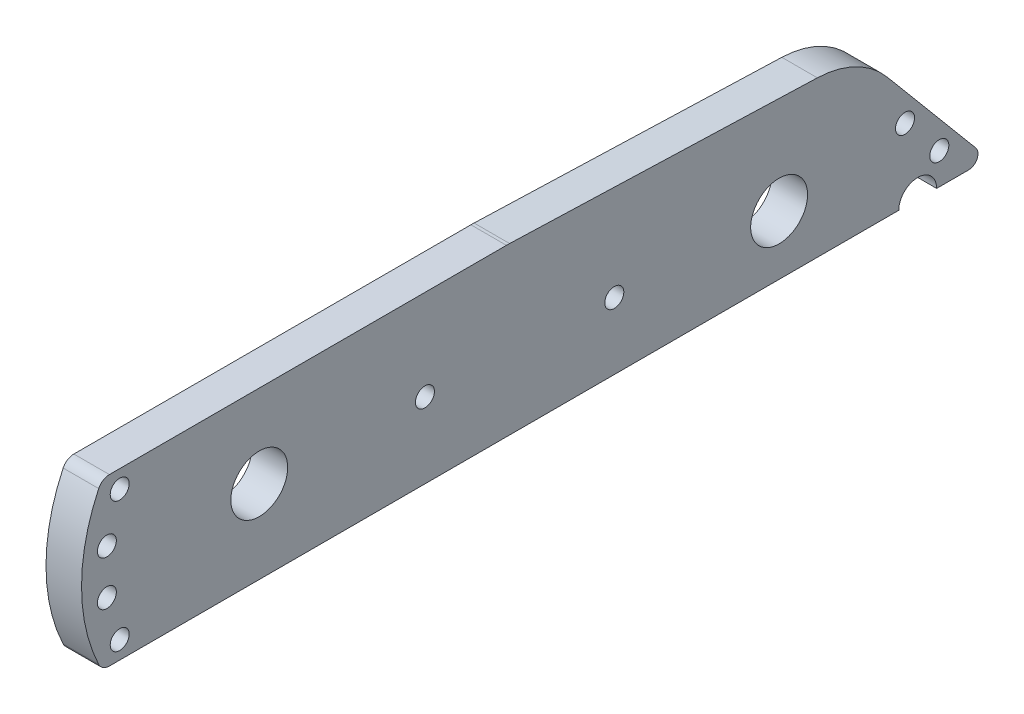
ISO-10303-21;
HEADER;
FILE_DESCRIPTION(('STEP AP214'),'2;1');
FILE_NAME('part.step','',(''),(''),'','','');
FILE_SCHEMA(('AUTOMOTIVE_DESIGN { 1 0 10303 214 1 1 1 1 }'));
ENDSEC;
DATA;
#1=APPLICATION_CONTEXT('core data for automotive mechanical design processes');
#2=APPLICATION_PROTOCOL_DEFINITION('international standard','automotive_design',2000,#1);
#3=PRODUCT_CONTEXT('',#1,'mechanical');
#4=PRODUCT('Part','Part','',(#3));
#5=PRODUCT_RELATED_PRODUCT_CATEGORY('part','',(#4));
#6=PRODUCT_DEFINITION_FORMATION('','',#4);
#7=PRODUCT_DEFINITION_CONTEXT('part definition',#1,'design');
#8=PRODUCT_DEFINITION('design','',#6,#7);
#9=PRODUCT_DEFINITION_SHAPE('','',#8);
#10=(LENGTH_UNIT() NAMED_UNIT(*) SI_UNIT(.MILLI.,.METRE.));
#11=(NAMED_UNIT(*) PLANE_ANGLE_UNIT() SI_UNIT($,.RADIAN.));
#12=(NAMED_UNIT(*) SI_UNIT($,.STERADIAN.) SOLID_ANGLE_UNIT());
#13=UNCERTAINTY_MEASURE_WITH_UNIT(LENGTH_MEASURE(1.E-05),#10,'distance_accuracy_value','');
#14=(GEOMETRIC_REPRESENTATION_CONTEXT(3) GLOBAL_UNCERTAINTY_ASSIGNED_CONTEXT((#13)) GLOBAL_UNIT_ASSIGNED_CONTEXT((#10,
#11,#12)) REPRESENTATION_CONTEXT('',''));
#15=CARTESIAN_POINT('',(0.,0.,0.));
#16=DIRECTION('',(0.,0.,1.));
#17=DIRECTION('',(1.,0.,0.));
#18=AXIS2_PLACEMENT_3D('',#15,#16,#17);
#19=CARTESIAN_POINT('',(-4.7625,9.52500000000001,19.05));
#20=DIRECTION('',(0.,1.,0.));
#21=DIRECTION('',(0.,0.,1.));
#22=AXIS2_PLACEMENT_3D('',#19,#20,#21);
#23=PLANE('',#22);
#24=DIRECTION('',(0.,0.,1.));
#25=VECTOR('',#24,1.);
#26=CARTESIAN_POINT('',(4.7625,9.52500000000001,19.05));
#27=LINE('',#26,#25);
#28=CARTESIAN_POINT('',(4.7625,9.52500000000001,-171.39164647412));
#29=VERTEX_POINT('',#28);
#30=CARTESIAN_POINT('',(4.7625,9.52500000000001,40.1609262841384));
#31=VERTEX_POINT('',#30);
#32=EDGE_CURVE('E140',#29,#31,#27,.T.);
#33=ORIENTED_EDGE('',*,*,#32,.T.);
#34=DIRECTION('',(1.,0.,0.));
#35=VECTOR('',#34,1.);
#36=CARTESIAN_POINT('',(-4.7625,9.52500000000001,40.1609262841384));
#37=LINE('',#36,#35);
#38=CARTESIAN_POINT('',(-4.7625,9.52500000000001,40.1609262841384));
#39=VERTEX_POINT('',#38);
#40=EDGE_CURVE('E264',#31,#39,#37,.F.);
#41=ORIENTED_EDGE('',*,*,#40,.T.);
#42=DIRECTION('',(0.,0.,1.));
#43=VECTOR('',#42,1.);
#44=CARTESIAN_POINT('',(-4.7625,9.52500000000001,-195.537119934818));
#45=LINE('',#44,#43);
#46=CARTESIAN_POINT('',(-4.7625,9.52500000000001,-171.39164647412));
#47=VERTEX_POINT('',#46);
#48=EDGE_CURVE('E205',#47,#39,#45,.T.);
#49=ORIENTED_EDGE('',*,*,#48,.F.);
#50=DIRECTION('',(1.,0.,0.));
#51=VECTOR('',#50,1.);
#52=CARTESIAN_POINT('',(-51.5687806053458,9.52500000000001,-171.39164647412));
#53=LINE('',#52,#51);
#54=EDGE_CURVE('E149',#47,#29,#53,.T.);
#55=ORIENTED_EDGE('',*,*,#54,.T.);
#56=EDGE_LOOP('',(#33,#41,#49,#55));
#57=FACE_BOUND('',#56,.T.);
#58=ADVANCED_FACE('F37',(#57),#23,.F.);
#59=CARTESIAN_POINT('',(-4.7625,31.75,0.));
#60=DIRECTION('',(1.,0.,0.));
#61=DIRECTION('',(0.,0.,-1.));
#62=AXIS2_PLACEMENT_3D('',#59,#60,#61);
#63=PLANE('',#62);
#64=CARTESIAN_POINT('',(-4.7625,49.2125,37.3990202913124));
#65=DIRECTION('',(-1.,0.,0.));
#66=DIRECTION('',(0.,0.,1.));
#67=AXIS2_PLACEMENT_3D('',#64,#65,#66);
#68=CIRCLE('',#67,2.54);
#69=CARTESIAN_POINT('',(-4.7625,49.2125,39.9390202913124));
#70=VERTEX_POINT('',#69);
#71=EDGE_CURVE('E161',#70,#70,#68,.T.);
#72=ORIENTED_EDGE('',*,*,#71,.F.);
#73=EDGE_LOOP('',(#72));
#74=FACE_BOUND('',#73,.T.);
#75=CARTESIAN_POINT('',(-4.7625,37.7389524788158,40.8381938044092));
#76=DIRECTION('',(-1.,0.,0.));
#77=DIRECTION('',(0.,0.,1.));
#78=AXIS2_PLACEMENT_3D('',#75,#76,#77);
#79=CIRCLE('',#78,2.54);
#80=CARTESIAN_POINT('',(-4.7625,37.7389524788158,43.3781938044092));
#81=VERTEX_POINT('',#80);
#82=EDGE_CURVE('E165',#81,#81,#79,.T.);
#83=ORIENTED_EDGE('',*,*,#82,.F.);
#84=EDGE_LOOP('',(#83));
#85=FACE_BOUND('',#84,.T.);
#86=CARTESIAN_POINT('',(-4.7625,25.7610475211842,40.8381938044092));
#87=DIRECTION('',(-1.,0.,0.));
#88=DIRECTION('',(0.,0.,1.));
#89=AXIS2_PLACEMENT_3D('',#86,#87,#88);
#90=CIRCLE('',#89,2.54);
#91=CARTESIAN_POINT('',(-4.7625,25.7610475211842,43.3781938044092));
#92=VERTEX_POINT('',#91);
#93=EDGE_CURVE('E168',#92,#92,#90,.T.);
#94=ORIENTED_EDGE('',*,*,#93,.F.);
#95=EDGE_LOOP('',(#94));
#96=FACE_BOUND('',#95,.T.);
#97=CARTESIAN_POINT('',(-4.7625,14.2875,37.3990202913124));
#98=DIRECTION('',(-1.,0.,0.));
#99=DIRECTION('',(0.,0.,1.));
#100=AXIS2_PLACEMENT_3D('',#97,#98,#99);
#101=CIRCLE('',#100,2.54);
#102=CARTESIAN_POINT('',(-4.7625,14.2875,39.9390202913124));
#103=VERTEX_POINT('',#102);
#104=EDGE_CURVE('E158',#103,#103,#101,.T.);
#105=ORIENTED_EDGE('',*,*,#104,.F.);
#106=EDGE_LOOP('',(#105));
#107=FACE_BOUND('',#106,.T.);
#108=CARTESIAN_POINT('',(-4.7625,28.8892429303716,-173.071588618471));
#109=DIRECTION('',(-1.,0.,0.));
#110=DIRECTION('',(0.,0.,1.));
#111=AXIS2_PLACEMENT_3D('',#108,#109,#110);
#112=CIRCLE('',#111,2.55269999999998);
#113=CARTESIAN_POINT('',(-4.7625,28.8892429303716,-170.518888618471));
#114=VERTEX_POINT('',#113);
#115=EDGE_CURVE('E173',#114,#114,#112,.T.);
#116=ORIENTED_EDGE('',*,*,#115,.F.);
#117=EDGE_LOOP('',(#116));
#118=FACE_BOUND('',#117,.T.);
#119=CARTESIAN_POINT('',(-4.7625,17.9443829493092,-182.255416591868));
#120=DIRECTION('',(-1.,0.,0.));
#121=DIRECTION('',(0.,0.,1.));
#122=AXIS2_PLACEMENT_3D('',#119,#120,#121);
#123=CIRCLE('',#122,2.55269999999998);
#124=CARTESIAN_POINT('',(-4.7625,17.9443829493092,-179.702716591868));
#125=VERTEX_POINT('',#124);
#126=EDGE_CURVE('E177',#125,#125,#123,.T.);
#127=ORIENTED_EDGE('',*,*,#126,.F.);
#128=EDGE_LOOP('',(#127));
#129=FACE_BOUND('',#128,.T.);
#130=CARTESIAN_POINT('',(-4.7625,29.7262338371881,-44.4039060277163));
#131=DIRECTION('',(-1.,0.,0.));
#132=DIRECTION('',(0.,0.,1.));
#133=AXIS2_PLACEMENT_3D('',#130,#131,#132);
#134=CIRCLE('',#133,2.5527);
#135=CARTESIAN_POINT('',(-4.7625,29.7262338371881,-41.8512060277163));
#136=VERTEX_POINT('',#135);
#137=EDGE_CURVE('E181',#136,#136,#134,.T.);
#138=ORIENTED_EDGE('',*,*,#137,.F.);
#139=EDGE_LOOP('',(#138));
#140=FACE_BOUND('',#139,.T.);
#141=CARTESIAN_POINT('',(-4.7625,27.413358222546,-95.1512272022492));
#142=DIRECTION('',(-1.,0.,0.));
#143=DIRECTION('',(0.,0.,1.));
#144=AXIS2_PLACEMENT_3D('',#141,#142,#143);
#145=CIRCLE('',#144,2.55270000000001);
#146=CARTESIAN_POINT('',(-4.7625,27.413358222546,-92.5985272022492));
#147=VERTEX_POINT('',#146);
#148=EDGE_CURVE('E185',#147,#147,#145,.T.);
#149=ORIENTED_EDGE('',*,*,#148,.F.);
#150=EDGE_LOOP('',(#149));
#151=FACE_BOUND('',#150,.T.);
#152=DIRECTION('',(0.,-0.0336756555014837,-0.999432814263443));
#153=VECTOR('',#152,1.);
#154=CARTESIAN_POINT('',(-4.7625,50.8,-160.903282657976));
#155=LINE('',#154,#153);
#156=CARTESIAN_POINT('',(-4.7625,53.9605934822915,-67.102559503231));
#157=VERTEX_POINT('',#156);
#158=CARTESIAN_POINT('',(-4.7625,51.181459251911,-149.582258969293));
#159=VERTEX_POINT('',#158);
#160=EDGE_CURVE('E210',#157,#159,#155,.T.);
#161=ORIENTED_EDGE('',*,*,#160,.T.);
#162=CARTESIAN_POINT('',(-4.7625,25.7958657696195,-148.726897319555));
#163=DIRECTION('',(1.,0.,0.));
#164=DIRECTION('',(0.,0.,-1.));
#165=AXIS2_PLACEMENT_3D('',#162,#163,#164);
#166=CIRCLE('',#165,25.4);
#167=CARTESIAN_POINT('',(-4.7625,42.1226710556578,-168.184426174777));
#168=VERTEX_POINT('',#167);
#169=EDGE_CURVE('E45',#159,#168,#166,.F.);
#170=ORIENTED_EDGE('',*,*,#169,.T.);
#171=DIRECTION('',(0.,-0.766044443118974,-0.642787609686544));
#172=VECTOR('',#171,1.);
#173=CARTESIAN_POINT('',(-4.7625,9.52500000000001,-195.537119934818));
#174=LINE('',#173,#172);
#175=CARTESIAN_POINT('',(-4.7625,13.6976805286038,-192.035825242246));
#176=VERTEX_POINT('',#175);
#177=EDGE_CURVE('E150',#168,#176,#174,.T.);
#178=ORIENTED_EDGE('',*,*,#177,.T.);
#179=CARTESIAN_POINT('',(-4.7625,12.065,-190.090072356724));
#180=DIRECTION('',(1.,0.,0.));
#181=DIRECTION('',(0.,0.,-1.));
#182=AXIS2_PLACEMENT_3D('',#179,#180,#181);
#183=CIRCLE('',#182,2.54);
#184=CARTESIAN_POINT('',(-4.7625,9.52500000000001,-190.090072356724));
#185=VERTEX_POINT('',#184);
#186=EDGE_CURVE('E246',#176,#185,#183,.F.);
#187=ORIENTED_EDGE('',*,*,#186,.T.);
#188=CARTESIAN_POINT('',(-4.7625,9.52500000000001,-181.55164647412));
#189=VERTEX_POINT('',#188);
#190=EDGE_CURVE('E202',#185,#189,#45,.T.);
#191=ORIENTED_EDGE('',*,*,#190,.T.);
#192=CARTESIAN_POINT('',(-4.7625,9.52500000000001,-176.47164647412));
#193=DIRECTION('',(1.,0.,0.));
#194=DIRECTION('',(0.,0.,-1.));
#195=AXIS2_PLACEMENT_3D('',#192,#193,#194);
#196=CIRCLE('',#195,5.07999999999999);
#197=EDGE_CURVE('E148',#189,#47,#196,.T.);
#198=ORIENTED_EDGE('',*,*,#197,.T.);
#199=ORIENTED_EDGE('',*,*,#48,.T.);
#200=CARTESIAN_POINT('',(-4.7625,12.7,40.1609262841384));
#201=DIRECTION('',(1.,0.,0.));
#202=DIRECTION('',(0.,0.,-1.));
#203=AXIS2_PLACEMENT_3D('',#200,#201,#202);
#204=CIRCLE('',#203,3.175);
#205=CARTESIAN_POINT('',(-4.7625,11.3392857142857,43.0295638758626));
#206=VERTEX_POINT('',#205);
#207=EDGE_CURVE('E260',#39,#206,#204,.F.);
#208=ORIENTED_EDGE('',*,*,#207,.T.);
#209=CARTESIAN_POINT('',(-4.7625,31.75,0.));
#210=DIRECTION('',(-1.,0.,0.));
#211=DIRECTION('',(0.,0.,-1.));
#212=AXIS2_PLACEMENT_3D('',#209,#210,#211);
#213=CIRCLE('',#212,47.625);
#214=CARTESIAN_POINT('',(-4.7625,52.1607142857143,43.0295638758626));
#215=VERTEX_POINT('',#214);
#216=EDGE_CURVE('E204',#206,#215,#213,.T.);
#217=ORIENTED_EDGE('',*,*,#216,.T.);
#218=CARTESIAN_POINT('',(-4.7625,50.8,40.1609262841384));
#219=DIRECTION('',(1.,0.,0.));
#220=DIRECTION('',(0.,0.,-1.));
#221=AXIS2_PLACEMENT_3D('',#218,#219,#220);
#222=CIRCLE('',#221,3.175);
#223=CARTESIAN_POINT('',(-4.7625,53.975,40.1609262841384));
#224=VERTEX_POINT('',#223);
#225=EDGE_CURVE('E262',#215,#224,#222,.F.);
#226=ORIENTED_EDGE('',*,*,#225,.T.);
#227=DIRECTION('',(0.,0.,-1.));
#228=VECTOR('',#227,1.);
#229=CARTESIAN_POINT('',(-4.7625,53.975,19.05));
#230=LINE('',#229,#228);
#231=CARTESIAN_POINT('',(-4.7625,53.975,-66.2471978534934));
#232=VERTEX_POINT('',#231);
#233=EDGE_CURVE('E208',#224,#232,#230,.T.);
#234=ORIENTED_EDGE('',*,*,#233,.T.);
#235=CARTESIAN_POINT('',(-4.7625,28.575,-66.2471978534934));
#236=DIRECTION('',(1.,0.,0.));
#237=DIRECTION('',(0.,0.,-1.));
#238=AXIS2_PLACEMENT_3D('',#235,#236,#237);
#239=CIRCLE('',#238,25.4);
#240=EDGE_CURVE('E277',#232,#157,#239,.F.);
#241=ORIENTED_EDGE('',*,*,#240,.T.);
#242=EDGE_LOOP('',(#161,#170,#178,#187,#191,#198,#199,#208,#217,#226,#234,#241));
#243=FACE_BOUND('',#242,.T.);
#244=CARTESIAN_POINT('',(-4.7625,31.75,0.));
#245=DIRECTION('',(-1.,0.,0.));
#246=DIRECTION('',(0.,0.,1.));
#247=AXIS2_PLACEMENT_3D('',#244,#245,#246);
#248=CIRCLE('',#247,7.62);
#249=CARTESIAN_POINT('',(-4.7625,31.75,-7.62));
#250=VERTEX_POINT('',#249);
#251=EDGE_CURVE('E197',#250,#250,#248,.T.);
#252=ORIENTED_EDGE('',*,*,#251,.F.);
#253=EDGE_LOOP('',(#252));
#254=FACE_BOUND('',#253,.T.);
#255=CARTESIAN_POINT('',(-4.7625,25.4,-139.32677028468));
#256=DIRECTION('',(-1.,0.,0.));
#257=DIRECTION('',(0.,0.,1.));
#258=AXIS2_PLACEMENT_3D('',#255,#256,#257);
#259=CIRCLE('',#258,7.62);
#260=CARTESIAN_POINT('',(-4.7625,25.4,-146.94677028468));
#261=VERTEX_POINT('',#260);
#262=EDGE_CURVE('E189',#261,#261,#259,.T.);
#263=ORIENTED_EDGE('',*,*,#262,.F.);
#264=EDGE_LOOP('',(#263));
#265=FACE_BOUND('',#264,.T.);
#266=ADVANCED_FACE('F281',(#74,#85,#96,#107,#118,#129,#140,#151,#243,#254,#265),#63,.F.);
#267=CARTESIAN_POINT('',(4.7625,31.75,0.));
#268=DIRECTION('',(1.,0.,0.));
#269=DIRECTION('',(0.,0.,-1.));
#270=AXIS2_PLACEMENT_3D('',#267,#268,#269);
#271=PLANE('',#270);
#272=DIRECTION('',(0.,-0.766044443118974,-0.642787609686544));
#273=VECTOR('',#272,1.);
#274=CARTESIAN_POINT('',(4.7625,9.52500000000001,-195.537119934818));
#275=LINE('',#274,#273);
#276=CARTESIAN_POINT('',(4.7625,42.1226710556578,-168.184426174777));
#277=VERTEX_POINT('',#276);
#278=CARTESIAN_POINT('',(4.7625,13.6976805286038,-192.035825242246));
#279=VERTEX_POINT('',#278);
#280=EDGE_CURVE('E219',#277,#279,#275,.T.);
#281=ORIENTED_EDGE('',*,*,#280,.F.);
#282=CARTESIAN_POINT('',(4.7625,25.7958657696195,-148.726897319555));
#283=DIRECTION('',(1.,0.,0.));
#284=DIRECTION('',(0.,0.,-1.));
#285=AXIS2_PLACEMENT_3D('',#282,#283,#284);
#286=CIRCLE('',#285,25.4);
#287=CARTESIAN_POINT('',(4.7625,51.181459251911,-149.582258969293));
#288=VERTEX_POINT('',#287);
#289=EDGE_CURVE('E271',#277,#288,#286,.T.);
#290=ORIENTED_EDGE('',*,*,#289,.T.);
#291=DIRECTION('',(0.,-0.0336756555014837,-0.999432814263443));
#292=VECTOR('',#291,1.);
#293=CARTESIAN_POINT('',(4.7625,50.8,-160.903282657976));
#294=LINE('',#293,#292);
#295=CARTESIAN_POINT('',(4.7625,53.9605934822915,-67.102559503231));
#296=VERTEX_POINT('',#295);
#297=EDGE_CURVE('E217',#296,#288,#294,.T.);
#298=ORIENTED_EDGE('',*,*,#297,.F.);
#299=CARTESIAN_POINT('',(4.7625,28.575,-66.2471978534934));
#300=DIRECTION('',(1.,0.,0.));
#301=DIRECTION('',(0.,0.,-1.));
#302=AXIS2_PLACEMENT_3D('',#299,#300,#301);
#303=CIRCLE('',#302,25.4);
#304=CARTESIAN_POINT('',(4.7625,53.975,-66.2471978534934));
#305=VERTEX_POINT('',#304);
#306=EDGE_CURVE('E269',#296,#305,#303,.T.);
#307=ORIENTED_EDGE('',*,*,#306,.T.);
#308=DIRECTION('',(0.,0.,-1.));
#309=VECTOR('',#308,1.);
#310=CARTESIAN_POINT('',(4.7625,53.975,-66.675));
#311=LINE('',#310,#309);
#312=CARTESIAN_POINT('',(4.7625,53.975,40.1609262841384));
#313=VERTEX_POINT('',#312);
#314=EDGE_CURVE('E215',#313,#305,#311,.T.);
#315=ORIENTED_EDGE('',*,*,#314,.F.);
#316=CARTESIAN_POINT('',(4.7625,50.8,40.1609262841384));
#317=DIRECTION('',(1.,0.,0.));
#318=DIRECTION('',(0.,0.,-1.));
#319=AXIS2_PLACEMENT_3D('',#316,#317,#318);
#320=CIRCLE('',#319,3.175);
#321=CARTESIAN_POINT('',(4.7625,52.1607142857143,43.0295638758626));
#322=VERTEX_POINT('',#321);
#323=EDGE_CURVE('E253',#313,#322,#320,.T.);
#324=ORIENTED_EDGE('',*,*,#323,.T.);
#325=CARTESIAN_POINT('',(4.7625,31.75,0.));
#326=DIRECTION('',(-1.,0.,0.));
#327=DIRECTION('',(0.,0.,-1.));
#328=AXIS2_PLACEMENT_3D('',#325,#326,#327);
#329=CIRCLE('',#328,47.625);
#330=CARTESIAN_POINT('',(4.7625,11.3392857142857,43.0295638758626));
#331=VERTEX_POINT('',#330);
#332=EDGE_CURVE('E139',#331,#322,#329,.T.);
#333=ORIENTED_EDGE('',*,*,#332,.F.);
#334=CARTESIAN_POINT('',(4.7625,12.7,40.1609262841384));
#335=DIRECTION('',(1.,0.,0.));
#336=DIRECTION('',(0.,0.,-1.));
#337=AXIS2_PLACEMENT_3D('',#334,#335,#336);
#338=CIRCLE('',#337,3.175);
#339=EDGE_CURVE('E251',#331,#31,#338,.T.);
#340=ORIENTED_EDGE('',*,*,#339,.T.);
#341=ORIENTED_EDGE('',*,*,#32,.F.);
#342=CARTESIAN_POINT('',(4.7625,9.52500000000001,-176.47164647412));
#343=DIRECTION('',(1.,0.,0.));
#344=DIRECTION('',(0.,0.,-1.));
#345=AXIS2_PLACEMENT_3D('',#342,#343,#344);
#346=CIRCLE('',#345,5.07999999999999);
#347=CARTESIAN_POINT('',(4.7625,9.52500000000001,-181.55164647412));
#348=VERTEX_POINT('',#347);
#349=EDGE_CURVE('E145',#348,#29,#346,.T.);
#350=ORIENTED_EDGE('',*,*,#349,.F.);
#351=CARTESIAN_POINT('',(4.7625,9.52500000000001,-190.090072356724));
#352=VERTEX_POINT('',#351);
#353=EDGE_CURVE('E129',#352,#348,#27,.T.);
#354=ORIENTED_EDGE('',*,*,#353,.F.);
#355=CARTESIAN_POINT('',(4.7625,12.065,-190.090072356724));
#356=DIRECTION('',(1.,0.,0.));
#357=DIRECTION('',(0.,0.,-1.));
#358=AXIS2_PLACEMENT_3D('',#355,#356,#357);
#359=CIRCLE('',#358,2.54);
#360=EDGE_CURVE('E241',#352,#279,#359,.T.);
#361=ORIENTED_EDGE('',*,*,#360,.T.);
#362=EDGE_LOOP('',(#281,#290,#298,#307,#315,#324,#333,#340,#341,#350,#354,#361));
#363=FACE_BOUND('',#362,.T.);
#364=CARTESIAN_POINT('',(4.7625,49.2125,37.3990202913124));
#365=DIRECTION('',(1.,0.,0.));
#366=DIRECTION('',(0.,0.,-1.));
#367=AXIS2_PLACEMENT_3D('',#364,#365,#366);
#368=CIRCLE('',#367,2.54);
#369=CARTESIAN_POINT('',(4.7625,49.2125,34.8590202913124));
#370=VERTEX_POINT('',#369);
#371=EDGE_CURVE('E180',#370,#370,#368,.T.);
#372=ORIENTED_EDGE('',*,*,#371,.F.);
#373=EDGE_LOOP('',(#372));
#374=FACE_BOUND('',#373,.T.);
#375=CARTESIAN_POINT('',(4.7625,37.7389524788158,40.8381938044092));
#376=DIRECTION('',(1.,0.,0.));
#377=DIRECTION('',(0.,0.,-1.));
#378=AXIS2_PLACEMENT_3D('',#375,#376,#377);
#379=CIRCLE('',#378,2.54);
#380=CARTESIAN_POINT('',(4.7625,37.7389524788158,38.2981938044092));
#381=VERTEX_POINT('',#380);
#382=EDGE_CURVE('E234',#381,#381,#379,.T.);
#383=ORIENTED_EDGE('',*,*,#382,.F.);
#384=EDGE_LOOP('',(#383));
#385=FACE_BOUND('',#384,.T.);
#386=CARTESIAN_POINT('',(4.7625,25.7610475211842,40.8381938044092));
#387=DIRECTION('',(1.,0.,0.));
#388=DIRECTION('',(0.,0.,-1.));
#389=AXIS2_PLACEMENT_3D('',#386,#387,#388);
#390=CIRCLE('',#389,2.54);
#391=CARTESIAN_POINT('',(4.7625,25.7610475211842,38.2981938044092));
#392=VERTEX_POINT('',#391);
#393=EDGE_CURVE('E231',#392,#392,#390,.T.);
#394=ORIENTED_EDGE('',*,*,#393,.F.);
#395=EDGE_LOOP('',(#394));
#396=FACE_BOUND('',#395,.T.);
#397=CARTESIAN_POINT('',(4.7625,14.2875,37.3990202913124));
#398=DIRECTION('',(1.,0.,0.));
#399=DIRECTION('',(0.,0.,-1.));
#400=AXIS2_PLACEMENT_3D('',#397,#398,#399);
#401=CIRCLE('',#400,2.54);
#402=CARTESIAN_POINT('',(4.7625,14.2875,34.8590202913124));
#403=VERTEX_POINT('',#402);
#404=EDGE_CURVE('E164',#403,#403,#401,.T.);
#405=ORIENTED_EDGE('',*,*,#404,.F.);
#406=EDGE_LOOP('',(#405));
#407=FACE_BOUND('',#406,.T.);
#408=CARTESIAN_POINT('',(4.7625,28.8892429303716,-173.071588618471));
#409=DIRECTION('',(1.,0.,0.));
#410=DIRECTION('',(0.,0.,-1.));
#411=AXIS2_PLACEMENT_3D('',#408,#409,#410);
#412=CIRCLE('',#411,2.55269999999998);
#413=CARTESIAN_POINT('',(4.7625,28.8892429303716,-175.624288618471));
#414=VERTEX_POINT('',#413);
#415=EDGE_CURVE('E188',#414,#414,#412,.T.);
#416=ORIENTED_EDGE('',*,*,#415,.F.);
#417=EDGE_LOOP('',(#416));
#418=FACE_BOUND('',#417,.T.);
#419=CARTESIAN_POINT('',(4.7625,17.9443829493092,-182.255416591868));
#420=DIRECTION('',(1.,0.,0.));
#421=DIRECTION('',(0.,0.,-1.));
#422=AXIS2_PLACEMENT_3D('',#419,#420,#421);
#423=CIRCLE('',#422,2.55269999999998);
#424=CARTESIAN_POINT('',(4.7625,17.9443829493092,-184.808116591868));
#425=VERTEX_POINT('',#424);
#426=EDGE_CURVE('E176',#425,#425,#423,.T.);
#427=ORIENTED_EDGE('',*,*,#426,.F.);
#428=EDGE_LOOP('',(#427));
#429=FACE_BOUND('',#428,.T.);
#430=CARTESIAN_POINT('',(4.7625,29.7262338371881,-44.4039060277163));
#431=DIRECTION('',(1.,0.,0.));
#432=DIRECTION('',(0.,0.,-1.));
#433=AXIS2_PLACEMENT_3D('',#430,#431,#432);
#434=CIRCLE('',#433,2.5527);
#435=CARTESIAN_POINT('',(4.7625,29.7262338371881,-46.9566060277163));
#436=VERTEX_POINT('',#435);
#437=EDGE_CURVE('E196',#436,#436,#434,.T.);
#438=ORIENTED_EDGE('',*,*,#437,.F.);
#439=EDGE_LOOP('',(#438));
#440=FACE_BOUND('',#439,.T.);
#441=CARTESIAN_POINT('',(4.7625,27.413358222546,-95.1512272022492));
#442=DIRECTION('',(1.,0.,0.));
#443=DIRECTION('',(0.,0.,-1.));
#444=AXIS2_PLACEMENT_3D('',#441,#442,#443);
#445=CIRCLE('',#444,2.55270000000001);
#446=CARTESIAN_POINT('',(4.7625,27.413358222546,-97.7039272022492));
#447=VERTEX_POINT('',#446);
#448=EDGE_CURVE('E184',#447,#447,#445,.T.);
#449=ORIENTED_EDGE('',*,*,#448,.F.);
#450=EDGE_LOOP('',(#449));
#451=FACE_BOUND('',#450,.T.);
#452=CARTESIAN_POINT('',(4.7625,31.75,0.));
#453=DIRECTION('',(-1.,0.,0.));
#454=DIRECTION('',(0.,0.,1.));
#455=AXIS2_PLACEMENT_3D('',#452,#453,#454);
#456=CIRCLE('',#455,7.62);
#457=CARTESIAN_POINT('',(4.7625,31.75,-7.62));
#458=VERTEX_POINT('',#457);
#459=EDGE_CURVE('E192',#458,#458,#456,.T.);
#460=ORIENTED_EDGE('',*,*,#459,.T.);
#461=EDGE_LOOP('',(#460));
#462=FACE_BOUND('',#461,.T.);
#463=CARTESIAN_POINT('',(4.7625,25.4,-139.32677028468));
#464=DIRECTION('',(-1.,0.,0.));
#465=DIRECTION('',(0.,0.,1.));
#466=AXIS2_PLACEMENT_3D('',#463,#464,#465);
#467=CIRCLE('',#466,7.62);
#468=CARTESIAN_POINT('',(4.7625,25.4,-146.94677028468));
#469=VERTEX_POINT('',#468);
#470=EDGE_CURVE('E193',#469,#469,#467,.T.);
#471=ORIENTED_EDGE('',*,*,#470,.T.);
#472=EDGE_LOOP('',(#471));
#473=FACE_BOUND('',#472,.T.);
#474=ADVANCED_FACE('F154',(#363,#374,#385,#396,#407,#418,#429,#440,#451,#462,#473),#271,.T.);
#475=ORIENTED_EDGE('',*,*,#190,.F.);
#476=DIRECTION('',(1.,0.,0.));
#477=VECTOR('',#476,1.);
#478=CARTESIAN_POINT('',(-4.7625,9.52500000000001,-190.090072356724));
#479=LINE('',#478,#477);
#480=EDGE_CURVE('E135',#185,#352,#479,.T.);
#481=ORIENTED_EDGE('',*,*,#480,.T.);
#482=ORIENTED_EDGE('',*,*,#353,.T.);
#483=DIRECTION('',(1.,0.,0.));
#484=VECTOR('',#483,1.);
#485=CARTESIAN_POINT('',(-51.5687806053458,9.52500000000001,-181.55164647412));
#486=LINE('',#485,#484);
#487=EDGE_CURVE('E133',#348,#189,#486,.F.);
#488=ORIENTED_EDGE('',*,*,#487,.T.);
#489=EDGE_LOOP('',(#475,#481,#482,#488));
#490=FACE_BOUND('',#489,.T.);
#491=ADVANCED_FACE('F132',(#490),#23,.F.);
#492=CARTESIAN_POINT('',(-4.7625,31.75,0.));
#493=DIRECTION('',(1.,0.,0.));
#494=DIRECTION('',(0.,0.,-1.));
#495=AXIS2_PLACEMENT_3D('',#492,#493,#494);
#496=CYLINDRICAL_SURFACE('',#495,47.625);
#497=ORIENTED_EDGE('',*,*,#332,.T.);
#498=DIRECTION('',(1.,0.,0.));
#499=VECTOR('',#498,1.);
#500=CARTESIAN_POINT('',(-4.7625,52.1607142857143,43.0295638758626));
#501=LINE('',#500,#499);
#502=EDGE_CURVE('E258',#322,#215,#501,.F.);
#503=ORIENTED_EDGE('',*,*,#502,.T.);
#504=ORIENTED_EDGE('',*,*,#216,.F.);
#505=DIRECTION('',(1.,0.,0.));
#506=VECTOR('',#505,1.);
#507=CARTESIAN_POINT('',(-4.7625,11.3392857142857,43.0295638758626));
#508=LINE('',#507,#506);
#509=EDGE_CURVE('E255',#206,#331,#508,.T.);
#510=ORIENTED_EDGE('',*,*,#509,.T.);
#511=EDGE_LOOP('',(#497,#503,#504,#510));
#512=FACE_BOUND('',#511,.T.);
#513=ADVANCED_FACE('F304',(#512),#496,.T.);
#514=CARTESIAN_POINT('',(-4.7625,53.975,-66.675));
#515=DIRECTION('',(0.,-1.,0.));
#516=DIRECTION('',(0.,0.,-1.));
#517=AXIS2_PLACEMENT_3D('',#514,#515,#516);
#518=PLANE('',#517);
#519=ORIENTED_EDGE('',*,*,#314,.T.);
#520=DIRECTION('',(1.,0.,0.));
#521=VECTOR('',#520,1.);
#522=CARTESIAN_POINT('',(-4.7625,53.975,-66.2471978534934));
#523=LINE('',#522,#521);
#524=EDGE_CURVE('E11',#305,#232,#523,.F.);
#525=ORIENTED_EDGE('',*,*,#524,.T.);
#526=ORIENTED_EDGE('',*,*,#233,.F.);
#527=DIRECTION('',(1.,0.,0.));
#528=VECTOR('',#527,1.);
#529=CARTESIAN_POINT('',(-4.7625,53.975,40.1609262841384));
#530=LINE('',#529,#528);
#531=EDGE_CURVE('E248',#224,#313,#530,.T.);
#532=ORIENTED_EDGE('',*,*,#531,.T.);
#533=EDGE_LOOP('',(#519,#525,#526,#532));
#534=FACE_BOUND('',#533,.T.);
#535=ADVANCED_FACE('F296',(#534),#518,.F.);
#536=CARTESIAN_POINT('',(-4.7625,50.8,-160.903282657976));
#537=DIRECTION('',(0.,-0.999432814263443,0.0336756555014837));
#538=DIRECTION('',(0.,-0.0336756555014837,-0.999432814263443));
#539=AXIS2_PLACEMENT_3D('',#536,#537,#538);
#540=PLANE('',#539);
#541=ORIENTED_EDGE('',*,*,#297,.T.);
#542=DIRECTION('',(1.,0.,0.));
#543=VECTOR('',#542,1.);
#544=CARTESIAN_POINT('',(-4.7625,51.181459251911,-149.582258969293));
#545=LINE('',#544,#543);
#546=EDGE_CURVE('E58',#288,#159,#545,.F.);
#547=ORIENTED_EDGE('',*,*,#546,.T.);
#548=ORIENTED_EDGE('',*,*,#160,.F.);
#549=DIRECTION('',(1.,0.,0.));
#550=VECTOR('',#549,1.);
#551=CARTESIAN_POINT('',(-4.7625,53.9605934822915,-67.1025595032311));
#552=LINE('',#551,#550);
#553=EDGE_CURVE('E273',#157,#296,#552,.T.);
#554=ORIENTED_EDGE('',*,*,#553,.T.);
#555=EDGE_LOOP('',(#541,#547,#548,#554));
#556=FACE_BOUND('',#555,.T.);
#557=ADVANCED_FACE('F291',(#556),#540,.F.);
#558=CARTESIAN_POINT('',(-4.7625,9.52500000000001,-195.537119934818));
#559=DIRECTION('',(0.,-0.642787609686544,0.766044443118974));
#560=DIRECTION('',(0.,-0.766044443118974,-0.642787609686544));
#561=AXIS2_PLACEMENT_3D('',#558,#559,#560);
#562=PLANE('',#561);
#563=ORIENTED_EDGE('',*,*,#177,.F.);
#564=DIRECTION('',(1.,0.,0.));
#565=VECTOR('',#564,1.);
#566=CARTESIAN_POINT('',(-4.7625,42.1226710556577,-168.184426174777));
#567=LINE('',#566,#565);
#568=EDGE_CURVE('E266',#168,#277,#567,.T.);
#569=ORIENTED_EDGE('',*,*,#568,.T.);
#570=ORIENTED_EDGE('',*,*,#280,.T.);
#571=DIRECTION('',(1.,0.,0.));
#572=VECTOR('',#571,1.);
#573=CARTESIAN_POINT('',(-4.7625,13.6976805286038,-192.035825242246));
#574=LINE('',#573,#572);
#575=EDGE_CURVE('E243',#279,#176,#574,.F.);
#576=ORIENTED_EDGE('',*,*,#575,.T.);
#577=EDGE_LOOP('',(#563,#569,#570,#576));
#578=FACE_BOUND('',#577,.T.);
#579=ADVANCED_FACE('F286',(#578),#562,.F.);
#580=CARTESIAN_POINT('',(-4.7625,31.75,0.));
#581=DIRECTION('',(1.,0.,0.));
#582=DIRECTION('',(0.,0.,-1.));
#583=AXIS2_PLACEMENT_3D('',#580,#581,#582);
#584=CYLINDRICAL_SURFACE('',#583,7.62);
#585=CARTESIAN_POINT('',(-4.7625,31.75,-7.62));
#586=CARTESIAN_POINT('',(-4.66328125,31.75,-7.62));
#587=CARTESIAN_POINT('',(-4.5640625,31.75,-7.62));
#588=CARTESIAN_POINT('',(-4.365625,31.75,-7.62));
#589=CARTESIAN_POINT('',(-4.26640625,31.75,-7.62));
#590=CARTESIAN_POINT('',(-4.06796875,31.75,-7.62));
#591=CARTESIAN_POINT('',(-3.96875,31.75,-7.62));
#592=CARTESIAN_POINT('',(-3.7703125,31.75,-7.62));
#593=CARTESIAN_POINT('',(-3.67109375,31.75,-7.62));
#594=CARTESIAN_POINT('',(-3.47265625,31.75,-7.62));
#595=CARTESIAN_POINT('',(-3.3734375,31.75,-7.62));
#596=CARTESIAN_POINT('',(-3.175,31.75,-7.62));
#597=CARTESIAN_POINT('',(-3.07578125,31.75,-7.62));
#598=CARTESIAN_POINT('',(-2.87734375,31.75,-7.62));
#599=CARTESIAN_POINT('',(-2.778125,31.75,-7.62));
#600=CARTESIAN_POINT('',(-2.5796875,31.75,-7.62));
#601=CARTESIAN_POINT('',(-2.48046875,31.75,-7.62));
#602=CARTESIAN_POINT('',(-2.28203125,31.75,-7.62));
#603=CARTESIAN_POINT('',(-2.1828125,31.75,-7.62));
#604=CARTESIAN_POINT('',(-1.984375,31.75,-7.62));
#605=CARTESIAN_POINT('',(-1.88515625,31.75,-7.62));
#606=CARTESIAN_POINT('',(-1.68671875,31.75,-7.62));
#607=CARTESIAN_POINT('',(-1.5875,31.75,-7.62));
#608=CARTESIAN_POINT('',(-1.3890625,31.75,-7.62));
#609=CARTESIAN_POINT('',(-1.28984375,31.75,-7.62));
#610=CARTESIAN_POINT('',(-1.09140625,31.75,-7.62));
#611=CARTESIAN_POINT('',(-0.992187499999999,31.75,-7.62));
#612=CARTESIAN_POINT('',(-0.793749999999999,31.75,-7.62));
#613=CARTESIAN_POINT('',(-0.694531249999999,31.75,-7.62));
#614=CARTESIAN_POINT('',(-0.496093749999999,31.75,-7.62));
#615=CARTESIAN_POINT('',(-0.396874999999999,31.75,-7.62));
#616=CARTESIAN_POINT('',(-0.198437499999999,31.75,-7.62));
#617=CARTESIAN_POINT('',(-0.0992187499999992,31.75,-7.62));
#618=CARTESIAN_POINT('',(0.0992187500000009,31.75,-7.62));
#619=CARTESIAN_POINT('',(0.198437500000001,31.75,-7.62));
#620=CARTESIAN_POINT('',(0.396875000000001,31.75,-7.62));
#621=CARTESIAN_POINT('',(0.496093750000001,31.75,-7.62));
#622=CARTESIAN_POINT('',(0.694531250000001,31.75,-7.62));
#623=CARTESIAN_POINT('',(0.793750000000001,31.75,-7.62));
#624=CARTESIAN_POINT('',(0.992187500000002,31.75,-7.62));
#625=CARTESIAN_POINT('',(1.09140625,31.75,-7.62));
#626=CARTESIAN_POINT('',(1.28984375,31.75,-7.62));
#627=CARTESIAN_POINT('',(1.3890625,31.75,-7.62));
#628=CARTESIAN_POINT('',(1.5875,31.75,-7.62));
#629=CARTESIAN_POINT('',(1.68671875,31.75,-7.62));
#630=CARTESIAN_POINT('',(1.88515625,31.75,-7.62));
#631=CARTESIAN_POINT('',(1.984375,31.75,-7.62));
#632=CARTESIAN_POINT('',(2.1828125,31.75,-7.62));
#633=CARTESIAN_POINT('',(2.28203125,31.75,-7.62));
#634=CARTESIAN_POINT('',(2.48046875,31.75,-7.62));
#635=CARTESIAN_POINT('',(2.5796875,31.75,-7.62));
#636=CARTESIAN_POINT('',(2.778125,31.75,-7.62));
#637=CARTESIAN_POINT('',(2.87734375,31.75,-7.62));
#638=CARTESIAN_POINT('',(3.07578125,31.75,-7.62));
#639=CARTESIAN_POINT('',(3.175,31.75,-7.62));
#640=CARTESIAN_POINT('',(3.3734375,31.75,-7.62));
#641=CARTESIAN_POINT('',(3.47265625,31.75,-7.62));
#642=CARTESIAN_POINT('',(3.67109375,31.75,-7.62));
#643=CARTESIAN_POINT('',(3.7703125,31.75,-7.62));
#644=CARTESIAN_POINT('',(3.96875,31.75,-7.62));
#645=CARTESIAN_POINT('',(4.06796875,31.75,-7.62));
#646=CARTESIAN_POINT('',(4.26640625,31.75,-7.62));
#647=CARTESIAN_POINT('',(4.365625,31.75,-7.62));
#648=CARTESIAN_POINT('',(4.5640625,31.75,-7.62));
#649=CARTESIAN_POINT('',(4.66328125,31.75,-7.62));
#650=CARTESIAN_POINT('',(4.7625,31.75,-7.62));
#651=B_SPLINE_CURVE_WITH_KNOTS('',3,(#585,#586,#587,#588,#589,#590,#591,#592,#593,#594,#595,
#596,#597,#598,#599,#600,#601,#602,#603,#604,#605,#606,#607,#608,#609,#610,#611,#612,#613,#614,
#615,#616,#617,#618,#619,#620,#621,#622,#623,#624,#625,#626,#627,#628,#629,#630,#631,#632,#633,
#634,#635,#636,#637,#638,#639,#640,#641,#642,#643,#644,#645,#646,#647,#648,#649,#650),
.UNSPECIFIED.,.F.,.F.,(4,2,2,2,2,2,2,2,2,2,2,2,2,2,2,2,2,2,2,2,2,2,2,2,2,2,2,2,2,2,2,2,4),(0.,
0.297656250000001,0.595312500000001,0.892968750000001,1.190625,1.48828125,1.7859375,2.08359375,
2.38125,2.67890625,2.9765625,3.27421875,3.571875,3.86953125,4.1671875,4.46484375,4.7625,
5.06015625,5.3578125,5.65546875,5.953125,6.25078125000001,6.54843750000001,6.84609375000001,
7.14375000000001,7.44140625000001,7.73906250000001,8.03671875000001,8.33437500000001,
8.63203125000001,8.92968750000001,9.22734375000001,9.52500000000001),.UNSPECIFIED.);
#652=EDGE_CURVE('BSEAM345',#250,#458,#651,.T.);
#653=ORIENTED_EDGE('',*,*,#251,.T.);
#654=ORIENTED_EDGE('',*,*,#459,.F.);
#655=ORIENTED_EDGE('',*,*,#652,.T.);
#656=ORIENTED_EDGE('',*,*,#652,.F.);
#657=EDGE_LOOP('',(#653,#655,#654,#656));
#658=FACE_BOUND('',#657,.T.);
#659=ADVANCED_FACE('F345',(#658),#584,.F.);
#660=CARTESIAN_POINT('',(-4.7625,25.4,-139.32677028468));
#661=DIRECTION('',(1.,0.,0.));
#662=DIRECTION('',(0.,0.,-1.));
#663=AXIS2_PLACEMENT_3D('',#660,#661,#662);
#664=CYLINDRICAL_SURFACE('',#663,7.62);
#665=CARTESIAN_POINT('',(-4.7625,25.4,-146.94677028468));
#666=CARTESIAN_POINT('',(-4.66328125,25.4,-146.94677028468));
#667=CARTESIAN_POINT('',(-4.5640625,25.4,-146.94677028468));
#668=CARTESIAN_POINT('',(-4.365625,25.4,-146.94677028468));
#669=CARTESIAN_POINT('',(-4.26640625,25.4,-146.94677028468));
#670=CARTESIAN_POINT('',(-4.06796875,25.4,-146.94677028468));
#671=CARTESIAN_POINT('',(-3.96875,25.4,-146.94677028468));
#672=CARTESIAN_POINT('',(-3.7703125,25.4,-146.94677028468));
#673=CARTESIAN_POINT('',(-3.67109375,25.4,-146.94677028468));
#674=CARTESIAN_POINT('',(-3.47265625,25.4,-146.94677028468));
#675=CARTESIAN_POINT('',(-3.3734375,25.4,-146.94677028468));
#676=CARTESIAN_POINT('',(-3.175,25.4,-146.94677028468));
#677=CARTESIAN_POINT('',(-3.07578125,25.4,-146.94677028468));
#678=CARTESIAN_POINT('',(-2.87734375,25.4,-146.94677028468));
#679=CARTESIAN_POINT('',(-2.778125,25.4,-146.94677028468));
#680=CARTESIAN_POINT('',(-2.5796875,25.4,-146.94677028468));
#681=CARTESIAN_POINT('',(-2.48046875,25.4,-146.94677028468));
#682=CARTESIAN_POINT('',(-2.28203125,25.4,-146.94677028468));
#683=CARTESIAN_POINT('',(-2.1828125,25.4,-146.94677028468));
#684=CARTESIAN_POINT('',(-1.984375,25.4,-146.94677028468));
#685=CARTESIAN_POINT('',(-1.88515625,25.4,-146.94677028468));
#686=CARTESIAN_POINT('',(-1.68671875,25.4,-146.94677028468));
#687=CARTESIAN_POINT('',(-1.5875,25.4,-146.94677028468));
#688=CARTESIAN_POINT('',(-1.3890625,25.4,-146.94677028468));
#689=CARTESIAN_POINT('',(-1.28984375,25.4,-146.94677028468));
#690=CARTESIAN_POINT('',(-1.09140625,25.4,-146.94677028468));
#691=CARTESIAN_POINT('',(-0.992187499999999,25.4,-146.94677028468));
#692=CARTESIAN_POINT('',(-0.793749999999999,25.4,-146.94677028468));
#693=CARTESIAN_POINT('',(-0.694531249999999,25.4,-146.94677028468));
#694=CARTESIAN_POINT('',(-0.496093749999999,25.4,-146.94677028468));
#695=CARTESIAN_POINT('',(-0.396874999999999,25.4,-146.94677028468));
#696=CARTESIAN_POINT('',(-0.198437499999999,25.4,-146.94677028468));
#697=CARTESIAN_POINT('',(-0.0992187499999992,25.4,-146.94677028468));
#698=CARTESIAN_POINT('',(0.0992187500000009,25.4,-146.94677028468));
#699=CARTESIAN_POINT('',(0.198437500000001,25.4,-146.94677028468));
#700=CARTESIAN_POINT('',(0.396875000000001,25.4,-146.94677028468));
#701=CARTESIAN_POINT('',(0.496093750000001,25.4,-146.94677028468));
#702=CARTESIAN_POINT('',(0.694531250000001,25.4,-146.94677028468));
#703=CARTESIAN_POINT('',(0.793750000000001,25.4,-146.94677028468));
#704=CARTESIAN_POINT('',(0.992187500000002,25.4,-146.94677028468));
#705=CARTESIAN_POINT('',(1.09140625,25.4,-146.94677028468));
#706=CARTESIAN_POINT('',(1.28984375,25.4,-146.94677028468));
#707=CARTESIAN_POINT('',(1.3890625,25.4,-146.94677028468));
#708=CARTESIAN_POINT('',(1.5875,25.4,-146.94677028468));
#709=CARTESIAN_POINT('',(1.68671875,25.4,-146.94677028468));
#710=CARTESIAN_POINT('',(1.88515625,25.4,-146.94677028468));
#711=CARTESIAN_POINT('',(1.984375,25.4,-146.94677028468));
#712=CARTESIAN_POINT('',(2.1828125,25.4,-146.94677028468));
#713=CARTESIAN_POINT('',(2.28203125,25.4,-146.94677028468));
#714=CARTESIAN_POINT('',(2.48046875,25.4,-146.94677028468));
#715=CARTESIAN_POINT('',(2.5796875,25.4,-146.94677028468));
#716=CARTESIAN_POINT('',(2.778125,25.4,-146.94677028468));
#717=CARTESIAN_POINT('',(2.87734375,25.4,-146.94677028468));
#718=CARTESIAN_POINT('',(3.07578125,25.4,-146.94677028468));
#719=CARTESIAN_POINT('',(3.175,25.4,-146.94677028468));
#720=CARTESIAN_POINT('',(3.3734375,25.4,-146.94677028468));
#721=CARTESIAN_POINT('',(3.47265625,25.4,-146.94677028468));
#722=CARTESIAN_POINT('',(3.67109375,25.4,-146.94677028468));
#723=CARTESIAN_POINT('',(3.7703125,25.4,-146.94677028468));
#724=CARTESIAN_POINT('',(3.96875,25.4,-146.94677028468));
#725=CARTESIAN_POINT('',(4.06796875,25.4,-146.94677028468));
#726=CARTESIAN_POINT('',(4.26640625,25.4,-146.94677028468));
#727=CARTESIAN_POINT('',(4.365625,25.4,-146.94677028468));
#728=CARTESIAN_POINT('',(4.5640625,25.4,-146.94677028468));
#729=CARTESIAN_POINT('',(4.66328125,25.4,-146.94677028468));
#730=CARTESIAN_POINT('',(4.7625,25.4,-146.94677028468));
#731=B_SPLINE_CURVE_WITH_KNOTS('',3,(#665,#666,#667,#668,#669,#670,#671,#672,#673,#674,#675,
#676,#677,#678,#679,#680,#681,#682,#683,#684,#685,#686,#687,#688,#689,#690,#691,#692,#693,#694,
#695,#696,#697,#698,#699,#700,#701,#702,#703,#704,#705,#706,#707,#708,#709,#710,#711,#712,#713,
#714,#715,#716,#717,#718,#719,#720,#721,#722,#723,#724,#725,#726,#727,#728,#729,#730),
.UNSPECIFIED.,.F.,.F.,(4,2,2,2,2,2,2,2,2,2,2,2,2,2,2,2,2,2,2,2,2,2,2,2,2,2,2,2,2,2,2,2,4),(0.,
0.297656250000001,0.595312500000001,0.892968750000001,1.190625,1.48828125,1.7859375,2.08359375,
2.38125,2.67890625,2.9765625,3.27421875,3.571875,3.86953125,4.1671875,4.46484375,4.7625,
5.06015625,5.3578125,5.65546875,5.953125,6.25078125000001,6.54843750000001,6.84609375000001,
7.14375000000001,7.44140625000001,7.73906250000001,8.03671875000001,8.33437500000001,
8.63203125000001,8.92968750000001,9.22734375000001,9.52500000000001),.UNSPECIFIED.);
#732=EDGE_CURVE('BSEAM368',#261,#469,#731,.T.);
#733=ORIENTED_EDGE('',*,*,#262,.T.);
#734=ORIENTED_EDGE('',*,*,#470,.F.);
#735=ORIENTED_EDGE('',*,*,#732,.T.);
#736=ORIENTED_EDGE('',*,*,#732,.F.);
#737=EDGE_LOOP('',(#733,#735,#734,#736));
#738=FACE_BOUND('',#737,.T.);
#739=ADVANCED_FACE('F368',(#738),#664,.F.);
#740=CARTESIAN_POINT('',(340.493780605346,27.413358222546,-95.1512272022492));
#741=DIRECTION('',(-1.,0.,0.));
#742=DIRECTION('',(0.,0.,1.));
#743=AXIS2_PLACEMENT_3D('',#740,#741,#742);
#744=CYLINDRICAL_SURFACE('',#743,2.55270000000001);
#745=ORIENTED_EDGE('',*,*,#448,.T.);
#746=EDGE_LOOP('',(#745));
#747=FACE_BOUND('',#746,.T.);
#748=ORIENTED_EDGE('',*,*,#148,.T.);
#749=EDGE_LOOP('',(#748));
#750=FACE_BOUND('',#749,.T.);
#751=ADVANCED_FACE('F375',(#747,#750),#744,.F.);
#752=CARTESIAN_POINT('',(340.493780605346,29.7262338371881,-44.4039060277163));
#753=DIRECTION('',(-1.,0.,0.));
#754=DIRECTION('',(0.,0.,1.));
#755=AXIS2_PLACEMENT_3D('',#752,#753,#754);
#756=CYLINDRICAL_SURFACE('',#755,2.5527);
#757=ORIENTED_EDGE('',*,*,#437,.T.);
#758=EDGE_LOOP('',(#757));
#759=FACE_BOUND('',#758,.T.);
#760=ORIENTED_EDGE('',*,*,#137,.T.);
#761=EDGE_LOOP('',(#760));
#762=FACE_BOUND('',#761,.T.);
#763=ADVANCED_FACE('F383',(#759,#762),#756,.F.);
#764=CARTESIAN_POINT('',(340.493780605346,17.9443829493092,-182.255416591868));
#765=DIRECTION('',(-1.,0.,0.));
#766=DIRECTION('',(0.,0.,1.));
#767=AXIS2_PLACEMENT_3D('',#764,#765,#766);
#768=CYLINDRICAL_SURFACE('',#767,2.55269999999998);
#769=ORIENTED_EDGE('',*,*,#426,.T.);
#770=EDGE_LOOP('',(#769));
#771=FACE_BOUND('',#770,.T.);
#772=ORIENTED_EDGE('',*,*,#126,.T.);
#773=EDGE_LOOP('',(#772));
#774=FACE_BOUND('',#773,.T.);
#775=ADVANCED_FACE('F391',(#771,#774),#768,.F.);
#776=CARTESIAN_POINT('',(340.493780605346,28.8892429303716,-173.071588618471));
#777=DIRECTION('',(-1.,0.,0.));
#778=DIRECTION('',(0.,0.,1.));
#779=AXIS2_PLACEMENT_3D('',#776,#777,#778);
#780=CYLINDRICAL_SURFACE('',#779,2.55269999999998);
#781=ORIENTED_EDGE('',*,*,#415,.T.);
#782=EDGE_LOOP('',(#781));
#783=FACE_BOUND('',#782,.T.);
#784=ORIENTED_EDGE('',*,*,#115,.T.);
#785=EDGE_LOOP('',(#784));
#786=FACE_BOUND('',#785,.T.);
#787=ADVANCED_FACE('F399',(#783,#786),#780,.F.);
#788=CARTESIAN_POINT('',(340.493780605346,14.2875,37.3990202913124));
#789=DIRECTION('',(-1.,0.,0.));
#790=DIRECTION('',(0.,0.,1.));
#791=AXIS2_PLACEMENT_3D('',#788,#789,#790);
#792=CYLINDRICAL_SURFACE('',#791,2.54);
#793=ORIENTED_EDGE('',*,*,#404,.T.);
#794=EDGE_LOOP('',(#793));
#795=FACE_BOUND('',#794,.T.);
#796=ORIENTED_EDGE('',*,*,#104,.T.);
#797=EDGE_LOOP('',(#796));
#798=FACE_BOUND('',#797,.T.);
#799=ADVANCED_FACE('F407',(#795,#798),#792,.F.);
#800=CARTESIAN_POINT('',(340.493780605346,25.7610475211842,40.8381938044092));
#801=DIRECTION('',(-1.,0.,0.));
#802=DIRECTION('',(0.,0.,1.));
#803=AXIS2_PLACEMENT_3D('',#800,#801,#802);
#804=CYLINDRICAL_SURFACE('',#803,2.54);
#805=ORIENTED_EDGE('',*,*,#393,.T.);
#806=EDGE_LOOP('',(#805));
#807=FACE_BOUND('',#806,.T.);
#808=ORIENTED_EDGE('',*,*,#93,.T.);
#809=EDGE_LOOP('',(#808));
#810=FACE_BOUND('',#809,.T.);
#811=ADVANCED_FACE('F415',(#807,#810),#804,.F.);
#812=CARTESIAN_POINT('',(340.493780605346,37.7389524788158,40.8381938044092));
#813=DIRECTION('',(-1.,0.,0.));
#814=DIRECTION('',(0.,0.,1.));
#815=AXIS2_PLACEMENT_3D('',#812,#813,#814);
#816=CYLINDRICAL_SURFACE('',#815,2.54);
#817=ORIENTED_EDGE('',*,*,#382,.T.);
#818=EDGE_LOOP('',(#817));
#819=FACE_BOUND('',#818,.T.);
#820=ORIENTED_EDGE('',*,*,#82,.T.);
#821=EDGE_LOOP('',(#820));
#822=FACE_BOUND('',#821,.T.);
#823=ADVANCED_FACE('F423',(#819,#822),#816,.F.);
#824=CARTESIAN_POINT('',(340.493780605346,49.2125,37.3990202913124));
#825=DIRECTION('',(-1.,0.,0.));
#826=DIRECTION('',(0.,0.,1.));
#827=AXIS2_PLACEMENT_3D('',#824,#825,#826);
#828=CYLINDRICAL_SURFACE('',#827,2.54);
#829=ORIENTED_EDGE('',*,*,#371,.T.);
#830=EDGE_LOOP('',(#829));
#831=FACE_BOUND('',#830,.T.);
#832=ORIENTED_EDGE('',*,*,#71,.T.);
#833=EDGE_LOOP('',(#832));
#834=FACE_BOUND('',#833,.T.);
#835=ADVANCED_FACE('F323',(#831,#834),#828,.F.);
#836=CARTESIAN_POINT('',(-51.5687806053458,9.52500000000001,-176.47164647412));
#837=DIRECTION('',(1.,0.,0.));
#838=DIRECTION('',(0.,0.,-1.));
#839=AXIS2_PLACEMENT_3D('',#836,#837,#838);
#840=CYLINDRICAL_SURFACE('',#839,5.07999999999999);
#841=ORIENTED_EDGE('',*,*,#197,.F.);
#842=ORIENTED_EDGE('',*,*,#487,.F.);
#843=ORIENTED_EDGE('',*,*,#349,.T.);
#844=ORIENTED_EDGE('',*,*,#54,.F.);
#845=EDGE_LOOP('',(#841,#842,#843,#844));
#846=FACE_BOUND('',#845,.T.);
#847=ADVANCED_FACE('F144',(#846),#840,.F.);
#848=CARTESIAN_POINT('',(-4.7625,12.065,-190.090072356724));
#849=DIRECTION('',(1.,0.,0.));
#850=DIRECTION('',(0.,0.,-1.));
#851=AXIS2_PLACEMENT_3D('',#848,#849,#850);
#852=CYLINDRICAL_SURFACE('',#851,2.54);
#853=ORIENTED_EDGE('',*,*,#186,.F.);
#854=ORIENTED_EDGE('',*,*,#575,.F.);
#855=ORIENTED_EDGE('',*,*,#360,.F.);
#856=ORIENTED_EDGE('',*,*,#480,.F.);
#857=EDGE_LOOP('',(#853,#854,#855,#856));
#858=FACE_BOUND('',#857,.T.);
#859=ADVANCED_FACE('F315',(#858),#852,.T.);
#860=CARTESIAN_POINT('',(-4.7625,50.8,40.1609262841384));
#861=DIRECTION('',(1.,0.,0.));
#862=DIRECTION('',(0.,0.,-1.));
#863=AXIS2_PLACEMENT_3D('',#860,#861,#862);
#864=CYLINDRICAL_SURFACE('',#863,3.175);
#865=ORIENTED_EDGE('',*,*,#225,.F.);
#866=ORIENTED_EDGE('',*,*,#502,.F.);
#867=ORIENTED_EDGE('',*,*,#323,.F.);
#868=ORIENTED_EDGE('',*,*,#531,.F.);
#869=EDGE_LOOP('',(#865,#866,#867,#868));
#870=FACE_BOUND('',#869,.T.);
#871=ADVANCED_FACE('F300',(#870),#864,.T.);
#872=CARTESIAN_POINT('',(-4.7625,12.7,40.1609262841384));
#873=DIRECTION('',(1.,0.,0.));
#874=DIRECTION('',(0.,0.,-1.));
#875=AXIS2_PLACEMENT_3D('',#872,#873,#874);
#876=CYLINDRICAL_SURFACE('',#875,3.175);
#877=ORIENTED_EDGE('',*,*,#207,.F.);
#878=ORIENTED_EDGE('',*,*,#40,.F.);
#879=ORIENTED_EDGE('',*,*,#339,.F.);
#880=ORIENTED_EDGE('',*,*,#509,.F.);
#881=EDGE_LOOP('',(#877,#878,#879,#880));
#882=FACE_BOUND('',#881,.T.);
#883=ADVANCED_FACE('F309',(#882),#876,.T.);
#884=CARTESIAN_POINT('',(-4.7625,25.7958657696195,-148.726897319555));
#885=DIRECTION('',(1.,0.,0.));
#886=DIRECTION('',(0.,0.,-1.));
#887=AXIS2_PLACEMENT_3D('',#884,#885,#886);
#888=CYLINDRICAL_SURFACE('',#887,25.4);
#889=ORIENTED_EDGE('',*,*,#169,.F.);
#890=ORIENTED_EDGE('',*,*,#546,.F.);
#891=ORIENTED_EDGE('',*,*,#289,.F.);
#892=ORIENTED_EDGE('',*,*,#568,.F.);
#893=EDGE_LOOP('',(#889,#890,#891,#892));
#894=FACE_BOUND('',#893,.T.);
#895=ADVANCED_FACE('F289',(#894),#888,.T.);
#896=CARTESIAN_POINT('',(-4.7625,28.575,-66.2471978534934));
#897=DIRECTION('',(1.,0.,0.));
#898=DIRECTION('',(0.,0.,-1.));
#899=AXIS2_PLACEMENT_3D('',#896,#897,#898);
#900=CYLINDRICAL_SURFACE('',#899,25.4);
#901=ORIENTED_EDGE('',*,*,#240,.F.);
#902=ORIENTED_EDGE('',*,*,#524,.F.);
#903=ORIENTED_EDGE('',*,*,#306,.F.);
#904=ORIENTED_EDGE('',*,*,#553,.F.);
#905=EDGE_LOOP('',(#901,#902,#903,#904));
#906=FACE_BOUND('',#905,.T.);
#907=ADVANCED_FACE('F39',(#906),#900,.T.);
#908=CLOSED_SHELL('',(#58,#266,#474,#491,#513,#535,#557,#579,#659,#739,#751,#763,#775,#787,#799,
#811,#823,#835,#847,#859,#871,#883,#895,#907));
#909=MANIFOLD_SOLID_BREP('B2',#908);
#910=ADVANCED_BREP_SHAPE_REPRESENTATION('',(#18,#909),#14);
#911=SHAPE_DEFINITION_REPRESENTATION(#9,#910);
ENDSEC;
END-ISO-10303-21;
